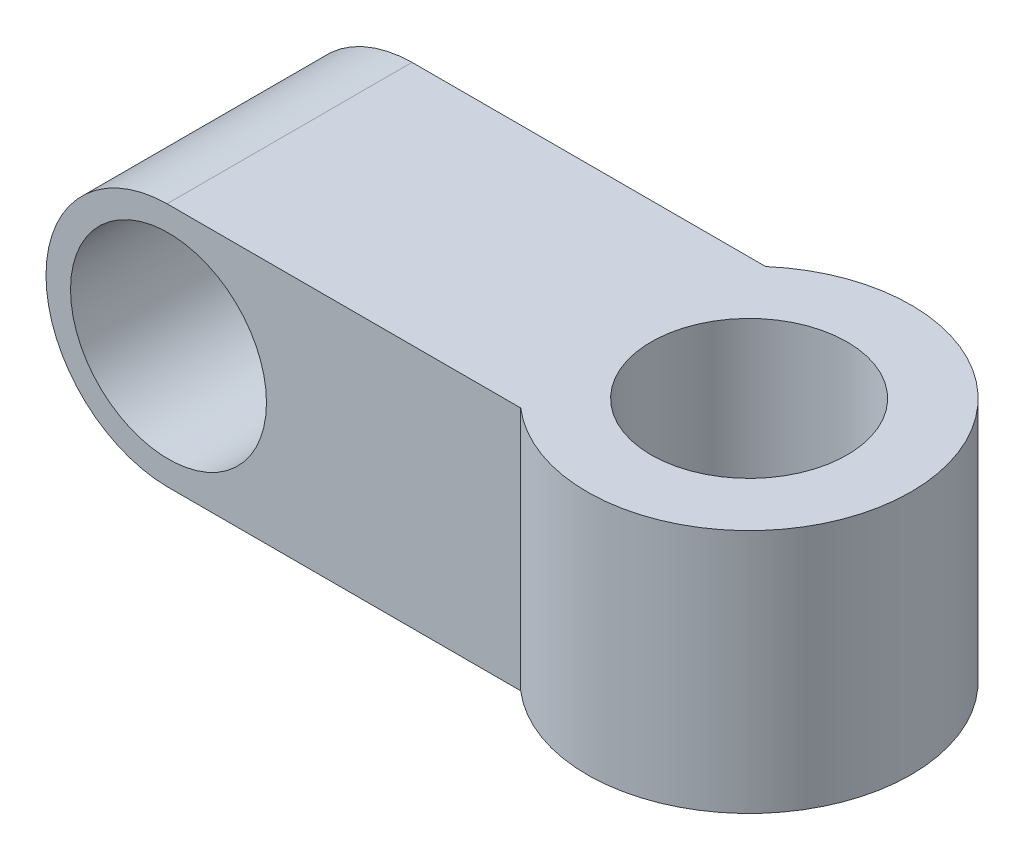
ISO-10303-21;
HEADER;
FILE_DESCRIPTION(('STEP AP214'),'2;1');
FILE_NAME('part.step','',(''),(''),'','','');
FILE_SCHEMA(('AUTOMOTIVE_DESIGN { 1 0 10303 214 1 1 1 1 }'));
ENDSEC;
DATA;
#1=APPLICATION_CONTEXT('core data for automotive mechanical design processes');
#2=APPLICATION_PROTOCOL_DEFINITION('international standard','automotive_design',2000,#1);
#3=PRODUCT_CONTEXT('',#1,'mechanical');
#4=PRODUCT('Part','Part','',(#3));
#5=PRODUCT_RELATED_PRODUCT_CATEGORY('part','',(#4));
#6=PRODUCT_DEFINITION_FORMATION('','',#4);
#7=PRODUCT_DEFINITION_CONTEXT('part definition',#1,'design');
#8=PRODUCT_DEFINITION('design','',#6,#7);
#9=PRODUCT_DEFINITION_SHAPE('','',#8);
#10=(LENGTH_UNIT() NAMED_UNIT(*) SI_UNIT(.MILLI.,.METRE.));
#11=(NAMED_UNIT(*) PLANE_ANGLE_UNIT() SI_UNIT($,.RADIAN.));
#12=(NAMED_UNIT(*) SI_UNIT($,.STERADIAN.) SOLID_ANGLE_UNIT());
#13=UNCERTAINTY_MEASURE_WITH_UNIT(LENGTH_MEASURE(1.E-05),#10,'distance_accuracy_value','');
#14=(GEOMETRIC_REPRESENTATION_CONTEXT(3) GLOBAL_UNCERTAINTY_ASSIGNED_CONTEXT((#13)) GLOBAL_UNIT_ASSIGNED_CONTEXT((#10,
#11,#12)) REPRESENTATION_CONTEXT('',''));
#15=CARTESIAN_POINT('',(0.,0.,0.));
#16=DIRECTION('',(0.,0.,1.));
#17=DIRECTION('',(1.,0.,0.));
#18=AXIS2_PLACEMENT_3D('',#15,#16,#17);
#19=CARTESIAN_POINT('',(0.,5.,0.));
#20=DIRECTION('',(0.,-1.,0.));
#21=DIRECTION('',(0.,0.,-1.));
#22=AXIS2_PLACEMENT_3D('',#19,#20,#21);
#23=CYLINDRICAL_SURFACE('',#22,3.30541441911779);
#24=DIRECTION('',(0.,-1.,0.));
#25=VECTOR('',#24,1.);
#26=CARTESIAN_POINT('',(-2.16235160926982,5.,-2.5));
#27=LINE('',#26,#25);
#28=CARTESIAN_POINT('',(-2.16235160926982,5.,-2.5));
#29=VERTEX_POINT('',#28);
#30=CARTESIAN_POINT('',(-2.16235160926982,0.,-2.5));
#31=VERTEX_POINT('',#30);
#32=EDGE_CURVE('E12',#29,#31,#27,.T.);
#33=ORIENTED_EDGE('',*,*,#32,.F.);
#34=CARTESIAN_POINT('',(0.,5.,0.));
#35=DIRECTION('',(0.,1.,0.));
#36=DIRECTION('',(0.,0.,1.));
#37=AXIS2_PLACEMENT_3D('',#34,#35,#36);
#38=CIRCLE('',#37,3.30541441911779);
#39=CARTESIAN_POINT('',(-2.16235160926982,5.,2.5));
#40=VERTEX_POINT('',#39);
#41=EDGE_CURVE('E142',#40,#29,#38,.T.);
#42=ORIENTED_EDGE('',*,*,#41,.F.);
#43=DIRECTION('',(0.,-1.,0.));
#44=VECTOR('',#43,1.);
#45=CARTESIAN_POINT('',(-2.16235160926982,5.,2.5));
#46=LINE('',#45,#44);
#47=CARTESIAN_POINT('',(-2.16235160926982,0.,2.5));
#48=VERTEX_POINT('',#47);
#49=EDGE_CURVE('E73',#40,#48,#46,.T.);
#50=ORIENTED_EDGE('',*,*,#49,.T.);
#51=CARTESIAN_POINT('',(0.,0.,0.));
#52=DIRECTION('',(0.,1.,0.));
#53=DIRECTION('',(0.,0.,1.));
#54=AXIS2_PLACEMENT_3D('',#51,#52,#53);
#55=CIRCLE('',#54,3.30541441911779);
#56=EDGE_CURVE('E109',#48,#31,#55,.T.);
#57=ORIENTED_EDGE('',*,*,#56,.T.);
#58=EDGE_LOOP('',(#33,#42,#50,#57));
#59=FACE_BOUND('',#58,.T.);
#60=ADVANCED_FACE('F65',(#59),#23,.T.);
#61=CARTESIAN_POINT('',(0.,5.,0.));
#62=DIRECTION('',(0.,1.,0.));
#63=DIRECTION('',(0.,0.,1.));
#64=AXIS2_PLACEMENT_3D('',#61,#62,#63);
#65=PLANE('',#64);
#66=CARTESIAN_POINT('',(0.,5.,0.));
#67=DIRECTION('',(0.,1.,0.));
#68=DIRECTION('',(0.,0.,1.));
#69=AXIS2_PLACEMENT_3D('',#66,#67,#68);
#70=CIRCLE('',#69,2.);
#71=CARTESIAN_POINT('',(0.,5.,2.));
#72=VERTEX_POINT('',#71);
#73=EDGE_CURVE('E134',#72,#72,#70,.T.);
#74=ORIENTED_EDGE('',*,*,#73,.F.);
#75=EDGE_LOOP('',(#74));
#76=FACE_BOUND('',#75,.T.);
#77=ORIENTED_EDGE('',*,*,#41,.T.);
#78=DIRECTION('',(-1.,0.,0.));
#79=VECTOR('',#78,1.);
#80=CARTESIAN_POINT('',(0.,5.,-2.5));
#81=LINE('',#80,#79);
#82=CARTESIAN_POINT('',(-9.38029662304984,5.,-2.5));
#83=VERTEX_POINT('',#82);
#84=EDGE_CURVE('E112',#29,#83,#81,.T.);
#85=ORIENTED_EDGE('',*,*,#84,.T.);
#86=DIRECTION('',(0.,0.,-1.));
#87=VECTOR('',#86,1.);
#88=CARTESIAN_POINT('',(-9.38029662304984,5.,2.5));
#89=LINE('',#88,#87);
#90=CARTESIAN_POINT('',(-9.38029662304984,5.,2.5));
#91=VERTEX_POINT('',#90);
#92=EDGE_CURVE('E127',#91,#83,#89,.T.);
#93=ORIENTED_EDGE('',*,*,#92,.F.);
#94=DIRECTION('',(-1.,0.,0.));
#95=VECTOR('',#94,1.);
#96=CARTESIAN_POINT('',(0.,5.,2.5));
#97=LINE('',#96,#95);
#98=EDGE_CURVE('E111',#40,#91,#97,.T.);
#99=ORIENTED_EDGE('',*,*,#98,.F.);
#100=EDGE_LOOP('',(#77,#85,#93,#99));
#101=FACE_BOUND('',#100,.T.);
#102=ADVANCED_FACE('F151',(#76,#101),#65,.T.);
#103=CARTESIAN_POINT('',(0.,0.,0.));
#104=DIRECTION('',(0.,1.,0.));
#105=DIRECTION('',(0.,0.,1.));
#106=AXIS2_PLACEMENT_3D('',#103,#104,#105);
#107=PLANE('',#106);
#108=CARTESIAN_POINT('',(0.,0.,0.));
#109=DIRECTION('',(0.,1.,0.));
#110=DIRECTION('',(0.,0.,1.));
#111=AXIS2_PLACEMENT_3D('',#108,#109,#110);
#112=CIRCLE('',#111,2.);
#113=CARTESIAN_POINT('',(0.,0.,2.));
#114=VERTEX_POINT('',#113);
#115=EDGE_CURVE('E138',#114,#114,#112,.T.);
#116=ORIENTED_EDGE('',*,*,#115,.T.);
#117=EDGE_LOOP('',(#116));
#118=FACE_BOUND('',#117,.T.);
#119=DIRECTION('',(-1.,0.,0.));
#120=VECTOR('',#119,1.);
#121=CARTESIAN_POINT('',(0.,0.,-2.5));
#122=LINE('',#121,#120);
#123=CARTESIAN_POINT('',(-9.38029662304984,0.,-2.5));
#124=VERTEX_POINT('',#123);
#125=EDGE_CURVE('E130',#31,#124,#122,.T.);
#126=ORIENTED_EDGE('',*,*,#125,.F.);
#127=ORIENTED_EDGE('',*,*,#56,.F.);
#128=DIRECTION('',(-1.,0.,0.));
#129=VECTOR('',#128,1.);
#130=CARTESIAN_POINT('',(0.,0.,2.5));
#131=LINE('',#130,#129);
#132=CARTESIAN_POINT('',(-9.38029662304984,0.,2.5));
#133=VERTEX_POINT('',#132);
#134=EDGE_CURVE('E80',#48,#133,#131,.T.);
#135=ORIENTED_EDGE('',*,*,#134,.T.);
#136=DIRECTION('',(0.,0.,-1.));
#137=VECTOR('',#136,1.);
#138=CARTESIAN_POINT('',(-9.38029662304984,0.,2.5));
#139=LINE('',#138,#137);
#140=EDGE_CURVE('E106',#133,#124,#139,.T.);
#141=ORIENTED_EDGE('',*,*,#140,.T.);
#142=EDGE_LOOP('',(#126,#127,#135,#141));
#143=FACE_BOUND('',#142,.T.);
#144=ADVANCED_FACE('F104',(#118,#143),#107,.F.);
#145=CARTESIAN_POINT('',(0.,5.,0.));
#146=DIRECTION('',(0.,-1.,0.));
#147=DIRECTION('',(0.,0.,-1.));
#148=AXIS2_PLACEMENT_3D('',#145,#146,#147);
#149=CYLINDRICAL_SURFACE('',#148,2.);
#150=ORIENTED_EDGE('',*,*,#73,.T.);
#151=EDGE_LOOP('',(#150));
#152=FACE_BOUND('',#151,.T.);
#153=ORIENTED_EDGE('',*,*,#115,.F.);
#154=EDGE_LOOP('',(#153));
#155=FACE_BOUND('',#154,.T.);
#156=ADVANCED_FACE('F182',(#152,#155),#149,.F.);
#157=CARTESIAN_POINT('',(0.,0.,-2.5));
#158=DIRECTION('',(0.,0.,1.));
#159=DIRECTION('',(1.,0.,0.));
#160=AXIS2_PLACEMENT_3D('',#157,#158,#159);
#161=PLANE('',#160);
#162=CARTESIAN_POINT('',(-9.35142611823068,2.5,-2.5));
#163=DIRECTION('',(0.,0.,1.));
#164=DIRECTION('',(1.,0.,0.));
#165=AXIS2_PLACEMENT_3D('',#162,#163,#164);
#166=CIRCLE('',#165,2.);
#167=CARTESIAN_POINT('',(-7.35142611823068,2.5,-2.5));
#168=VERTEX_POINT('',#167);
#169=EDGE_CURVE('E160',#168,#168,#166,.T.);
#170=ORIENTED_EDGE('',*,*,#169,.T.);
#171=EDGE_LOOP('',(#170));
#172=FACE_BOUND('',#171,.T.);
#173=ORIENTED_EDGE('',*,*,#84,.F.);
#174=ORIENTED_EDGE('',*,*,#32,.T.);
#175=ORIENTED_EDGE('',*,*,#125,.T.);
#176=CARTESIAN_POINT('',(-9.35142611823068,2.5,-2.5));
#177=DIRECTION('',(0.,0.,1.));
#178=DIRECTION('',(1.,0.,0.));
#179=AXIS2_PLACEMENT_3D('',#176,#177,#178);
#180=CIRCLE('',#179,2.50016669565221);
#181=EDGE_CURVE('E122',#83,#124,#180,.T.);
#182=ORIENTED_EDGE('',*,*,#181,.F.);
#183=EDGE_LOOP('',(#173,#174,#175,#182));
#184=FACE_BOUND('',#183,.T.);
#185=ADVANCED_FACE('F175',(#172,#184),#161,.F.);
#186=CARTESIAN_POINT('',(0.,0.,2.5));
#187=DIRECTION('',(0.,0.,1.));
#188=DIRECTION('',(1.,0.,0.));
#189=AXIS2_PLACEMENT_3D('',#186,#187,#188);
#190=PLANE('',#189);
#191=CARTESIAN_POINT('',(-9.35142611823068,2.5,2.5));
#192=DIRECTION('',(0.,0.,1.));
#193=DIRECTION('',(1.,0.,0.));
#194=AXIS2_PLACEMENT_3D('',#191,#192,#193);
#195=CIRCLE('',#194,2.);
#196=CARTESIAN_POINT('',(-7.35142611823068,2.5,2.5));
#197=VERTEX_POINT('',#196);
#198=EDGE_CURVE('E163',#197,#197,#195,.T.);
#199=ORIENTED_EDGE('',*,*,#198,.F.);
#200=EDGE_LOOP('',(#199));
#201=FACE_BOUND('',#200,.T.);
#202=ORIENTED_EDGE('',*,*,#49,.F.);
#203=ORIENTED_EDGE('',*,*,#98,.T.);
#204=CARTESIAN_POINT('',(-9.35142611823068,2.5,2.5));
#205=DIRECTION('',(0.,0.,1.));
#206=DIRECTION('',(1.,0.,0.));
#207=AXIS2_PLACEMENT_3D('',#204,#205,#206);
#208=CIRCLE('',#207,2.50016669565221);
#209=EDGE_CURVE('E115',#91,#133,#208,.T.);
#210=ORIENTED_EDGE('',*,*,#209,.T.);
#211=ORIENTED_EDGE('',*,*,#134,.F.);
#212=EDGE_LOOP('',(#202,#203,#210,#211));
#213=FACE_BOUND('',#212,.T.);
#214=ADVANCED_FACE('F116',(#201,#213),#190,.T.);
#215=CARTESIAN_POINT('',(-9.35142611823068,2.5,2.5));
#216=DIRECTION('',(0.,0.,-1.));
#217=DIRECTION('',(-1.,0.,0.));
#218=AXIS2_PLACEMENT_3D('',#215,#216,#217);
#219=CYLINDRICAL_SURFACE('',#218,2.50016669565221);
#220=ORIENTED_EDGE('',*,*,#181,.T.);
#221=ORIENTED_EDGE('',*,*,#140,.F.);
#222=ORIENTED_EDGE('',*,*,#209,.F.);
#223=ORIENTED_EDGE('',*,*,#92,.T.);
#224=EDGE_LOOP('',(#220,#221,#222,#223));
#225=FACE_BOUND('',#224,.T.);
#226=ADVANCED_FACE('F124',(#225),#219,.T.);
#227=CARTESIAN_POINT('',(-9.35142611823068,2.5,-3.30541441911779));
#228=DIRECTION('',(0.,0.,1.));
#229=DIRECTION('',(1.,0.,0.));
#230=AXIS2_PLACEMENT_3D('',#227,#228,#229);
#231=CYLINDRICAL_SURFACE('',#230,2.);
#232=CARTESIAN_POINT('',(-7.35142611823068,2.5,2.5));
#233=CARTESIAN_POINT('',(-7.35142611823068,2.5,2.44791666666667));
#234=CARTESIAN_POINT('',(-7.35142611823068,2.5,2.39583333333333));
#235=CARTESIAN_POINT('',(-7.35142611823068,2.5,2.29166666666667));
#236=CARTESIAN_POINT('',(-7.35142611823068,2.5,2.23958333333333));
#237=CARTESIAN_POINT('',(-7.35142611823068,2.5,2.13541666666667));
#238=CARTESIAN_POINT('',(-7.35142611823068,2.5,2.08333333333333));
#239=CARTESIAN_POINT('',(-7.35142611823068,2.5,1.97916666666667));
#240=CARTESIAN_POINT('',(-7.35142611823068,2.5,1.92708333333333));
#241=CARTESIAN_POINT('',(-7.35142611823068,2.5,1.82291666666667));
#242=CARTESIAN_POINT('',(-7.35142611823068,2.5,1.77083333333333));
#243=CARTESIAN_POINT('',(-7.35142611823068,2.5,1.66666666666667));
#244=CARTESIAN_POINT('',(-7.35142611823068,2.5,1.61458333333333));
#245=CARTESIAN_POINT('',(-7.35142611823068,2.5,1.51041666666667));
#246=CARTESIAN_POINT('',(-7.35142611823068,2.5,1.45833333333333));
#247=CARTESIAN_POINT('',(-7.35142611823068,2.5,1.35416666666667));
#248=CARTESIAN_POINT('',(-7.35142611823068,2.5,1.30208333333333));
#249=CARTESIAN_POINT('',(-7.35142611823068,2.5,1.19791666666667));
#250=CARTESIAN_POINT('',(-7.35142611823068,2.5,1.14583333333333));
#251=CARTESIAN_POINT('',(-7.35142611823068,2.5,1.04166666666667));
#252=CARTESIAN_POINT('',(-7.35142611823068,2.5,0.989583333333333));
#253=CARTESIAN_POINT('',(-7.35142611823068,2.5,0.885416666666666));
#254=CARTESIAN_POINT('',(-7.35142611823068,2.5,0.833333333333333));
#255=CARTESIAN_POINT('',(-7.35142611823068,2.5,0.729166666666666));
#256=CARTESIAN_POINT('',(-7.35142611823068,2.5,0.677083333333333));
#257=CARTESIAN_POINT('',(-7.35142611823068,2.5,0.572916666666666));
#258=CARTESIAN_POINT('',(-7.35142611823068,2.5,0.520833333333333));
#259=CARTESIAN_POINT('',(-7.35142611823068,2.5,0.416666666666666));
#260=CARTESIAN_POINT('',(-7.35142611823068,2.5,0.364583333333333));
#261=CARTESIAN_POINT('',(-7.35142611823068,2.5,0.260416666666666));
#262=CARTESIAN_POINT('',(-7.35142611823068,2.5,0.208333333333333));
#263=CARTESIAN_POINT('',(-7.35142611823068,2.5,0.104166666666666));
#264=CARTESIAN_POINT('',(-7.35142611823068,2.5,0.0520833333333329));
#265=CARTESIAN_POINT('',(-7.35142611823068,2.5,-0.0520833333333338));
#266=CARTESIAN_POINT('',(-7.35142611823068,2.5,-0.104166666666667));
#267=CARTESIAN_POINT('',(-7.35142611823068,2.5,-0.208333333333334));
#268=CARTESIAN_POINT('',(-7.35142611823068,2.5,-0.260416666666667));
#269=CARTESIAN_POINT('',(-7.35142611823068,2.5,-0.364583333333334));
#270=CARTESIAN_POINT('',(-7.35142611823068,2.5,-0.416666666666667));
#271=CARTESIAN_POINT('',(-7.35142611823068,2.5,-0.520833333333334));
#272=CARTESIAN_POINT('',(-7.35142611823068,2.5,-0.572916666666667));
#273=CARTESIAN_POINT('',(-7.35142611823068,2.5,-0.677083333333334));
#274=CARTESIAN_POINT('',(-7.35142611823068,2.5,-0.729166666666667));
#275=CARTESIAN_POINT('',(-7.35142611823068,2.5,-0.833333333333334));
#276=CARTESIAN_POINT('',(-7.35142611823068,2.5,-0.885416666666667));
#277=CARTESIAN_POINT('',(-7.35142611823068,2.5,-0.989583333333334));
#278=CARTESIAN_POINT('',(-7.35142611823068,2.5,-1.04166666666667));
#279=CARTESIAN_POINT('',(-7.35142611823068,2.5,-1.14583333333333));
#280=CARTESIAN_POINT('',(-7.35142611823068,2.5,-1.19791666666667));
#281=CARTESIAN_POINT('',(-7.35142611823068,2.5,-1.30208333333333));
#282=CARTESIAN_POINT('',(-7.35142611823068,2.5,-1.35416666666667));
#283=CARTESIAN_POINT('',(-7.35142611823068,2.5,-1.45833333333333));
#284=CARTESIAN_POINT('',(-7.35142611823068,2.5,-1.51041666666667));
#285=CARTESIAN_POINT('',(-7.35142611823068,2.5,-1.61458333333333));
#286=CARTESIAN_POINT('',(-7.35142611823068,2.5,-1.66666666666667));
#287=CARTESIAN_POINT('',(-7.35142611823068,2.5,-1.77083333333333));
#288=CARTESIAN_POINT('',(-7.35142611823068,2.5,-1.82291666666667));
#289=CARTESIAN_POINT('',(-7.35142611823068,2.5,-1.92708333333333));
#290=CARTESIAN_POINT('',(-7.35142611823068,2.5,-1.97916666666667));
#291=CARTESIAN_POINT('',(-7.35142611823068,2.5,-2.08333333333333));
#292=CARTESIAN_POINT('',(-7.35142611823068,2.5,-2.13541666666667));
#293=CARTESIAN_POINT('',(-7.35142611823068,2.5,-2.23958333333333));
#294=CARTESIAN_POINT('',(-7.35142611823068,2.5,-2.29166666666667));
#295=CARTESIAN_POINT('',(-7.35142611823068,2.5,-2.39583333333333));
#296=CARTESIAN_POINT('',(-7.35142611823068,2.5,-2.44791666666667));
#297=CARTESIAN_POINT('',(-7.35142611823068,2.5,-2.5));
#298=B_SPLINE_CURVE_WITH_KNOTS('',3,(#232,#233,#234,#235,#236,#237,#238,#239,#240,#241,#242,
#243,#244,#245,#246,#247,#248,#249,#250,#251,#252,#253,#254,#255,#256,#257,#258,#259,#260,#261,
#262,#263,#264,#265,#266,#267,#268,#269,#270,#271,#272,#273,#274,#275,#276,#277,#278,#279,#280,
#281,#282,#283,#284,#285,#286,#287,#288,#289,#290,#291,#292,#293,#294,#295,#296,#297),
.UNSPECIFIED.,.F.,.F.,(4,2,2,2,2,2,2,2,2,2,2,2,2,2,2,2,2,2,2,2,2,2,2,2,2,2,2,2,2,2,2,2,4),(0.,
0.15625,0.3125,0.46875,0.625,0.78125,0.9375,1.09375,1.25,1.40625,1.5625,1.71875,1.875,2.03125,
2.1875,2.34375,2.5,2.65625,2.8125,2.96875,3.125,3.28125,3.4375,3.59375,3.75,3.90625,4.0625,
4.21875,4.375,4.53125,4.6875,4.84375,5.),.UNSPECIFIED.);
#299=EDGE_CURVE('BSEAM171',#197,#168,#298,.T.);
#300=ORIENTED_EDGE('',*,*,#198,.T.);
#301=ORIENTED_EDGE('',*,*,#169,.F.);
#302=ORIENTED_EDGE('',*,*,#299,.T.);
#303=ORIENTED_EDGE('',*,*,#299,.F.);
#304=EDGE_LOOP('',(#300,#302,#301,#303));
#305=FACE_BOUND('',#304,.T.);
#306=ADVANCED_FACE('F171',(#305),#231,.F.);
#307=CLOSED_SHELL('',(#60,#102,#144,#156,#185,#214,#226,#306));
#308=MANIFOLD_SOLID_BREP('B2',#307);
#309=ADVANCED_BREP_SHAPE_REPRESENTATION('',(#18,#308),#14);
#310=SHAPE_DEFINITION_REPRESENTATION(#9,#309);
ENDSEC;
END-ISO-10303-21;
